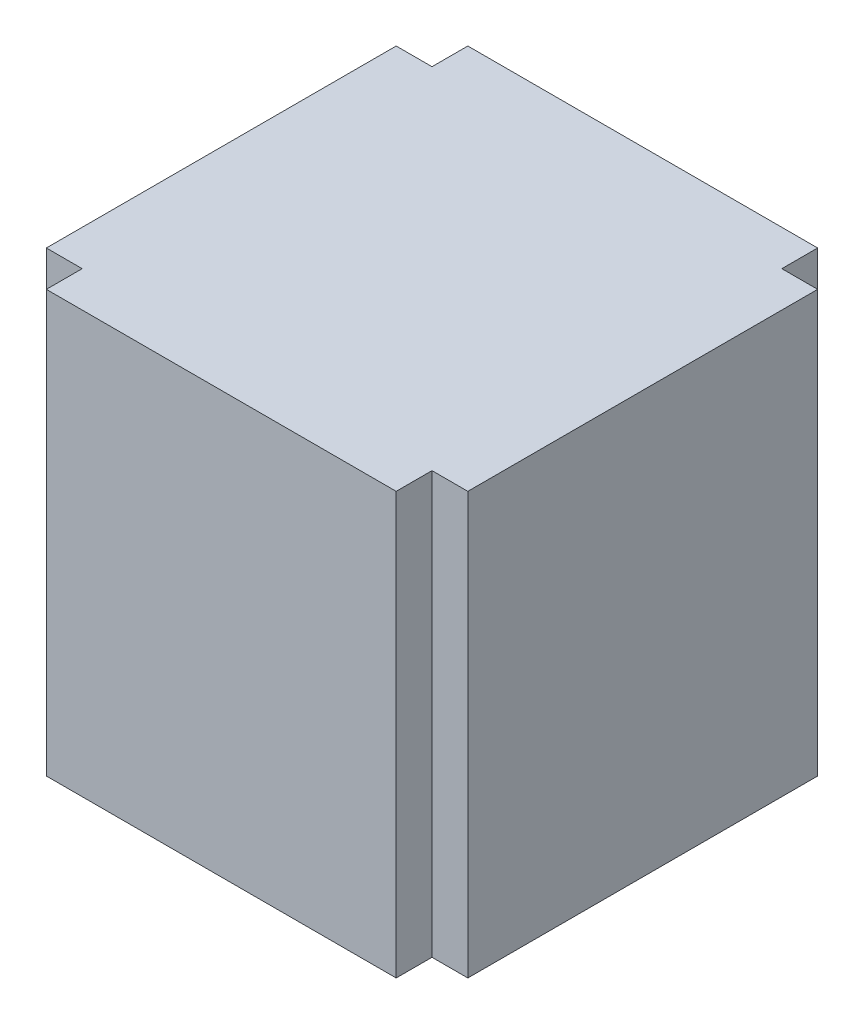
ISO-10303-21;
HEADER;
FILE_DESCRIPTION(('STEP AP214'),'2;1');
FILE_NAME('part.step','',(''),(''),'','','');
FILE_SCHEMA(('AUTOMOTIVE_DESIGN { 1 0 10303 214 1 1 1 1 }'));
ENDSEC;
DATA;
#1=APPLICATION_CONTEXT('core data for automotive mechanical design processes');
#2=APPLICATION_PROTOCOL_DEFINITION('international standard','automotive_design',2000,#1);
#3=PRODUCT_CONTEXT('',#1,'mechanical');
#4=PRODUCT('Part','Part','',(#3));
#5=PRODUCT_RELATED_PRODUCT_CATEGORY('part','',(#4));
#6=PRODUCT_DEFINITION_FORMATION('','',#4);
#7=PRODUCT_DEFINITION_CONTEXT('part definition',#1,'design');
#8=PRODUCT_DEFINITION('design','',#6,#7);
#9=PRODUCT_DEFINITION_SHAPE('','',#8);
#10=(LENGTH_UNIT() NAMED_UNIT(*) SI_UNIT(.MILLI.,.METRE.));
#11=(NAMED_UNIT(*) PLANE_ANGLE_UNIT() SI_UNIT($,.RADIAN.));
#12=(NAMED_UNIT(*) SI_UNIT($,.STERADIAN.) SOLID_ANGLE_UNIT());
#13=UNCERTAINTY_MEASURE_WITH_UNIT(LENGTH_MEASURE(1.E-05),#10,'distance_accuracy_value','');
#14=(GEOMETRIC_REPRESENTATION_CONTEXT(3) GLOBAL_UNCERTAINTY_ASSIGNED_CONTEXT((#13)) GLOBAL_UNIT_ASSIGNED_CONTEXT((#10,
#11,#12)) REPRESENTATION_CONTEXT('',''));
#15=CARTESIAN_POINT('',(0.,0.,0.));
#16=DIRECTION('',(0.,0.,1.));
#17=DIRECTION('',(1.,0.,0.));
#18=AXIS2_PLACEMENT_3D('',#15,#16,#17);
#19=CARTESIAN_POINT('',(41.5,50.,-41.5));
#20=DIRECTION('',(-1.,0.,0.));
#21=DIRECTION('',(0.,0.,1.));
#22=AXIS2_PLACEMENT_3D('',#19,#20,#21);
#23=PLANE('',#22);
#24=DIRECTION('',(0.,0.,-1.));
#25=VECTOR('',#24,1.);
#26=CARTESIAN_POINT('',(41.5,-50.,-41.5));
#27=LINE('',#26,#25);
#28=CARTESIAN_POINT('',(41.5,-50.,-41.5));
#29=VERTEX_POINT('',#28);
#30=CARTESIAN_POINT('',(41.5,-50.,-50.));
#31=VERTEX_POINT('',#30);
#32=EDGE_CURVE('E153',#29,#31,#27,.T.);
#33=ORIENTED_EDGE('',*,*,#32,.T.);
#34=DIRECTION('',(0.,-1.,0.));
#35=VECTOR('',#34,1.);
#36=CARTESIAN_POINT('',(41.5,50.,-50.));
#37=LINE('',#36,#35);
#38=CARTESIAN_POINT('',(41.5,50.,-50.));
#39=VERTEX_POINT('',#38);
#40=EDGE_CURVE('E11',#39,#31,#37,.T.);
#41=ORIENTED_EDGE('',*,*,#40,.F.);
#42=DIRECTION('',(0.,0.,-1.));
#43=VECTOR('',#42,1.);
#44=CARTESIAN_POINT('',(41.5,50.,-41.5));
#45=LINE('',#44,#43);
#46=CARTESIAN_POINT('',(41.5,50.,-41.5));
#47=VERTEX_POINT('',#46);
#48=EDGE_CURVE('E175',#47,#39,#45,.T.);
#49=ORIENTED_EDGE('',*,*,#48,.F.);
#50=DIRECTION('',(0.,-1.,0.));
#51=VECTOR('',#50,1.);
#52=CARTESIAN_POINT('',(41.5,50.,-41.5));
#53=LINE('',#52,#51);
#54=EDGE_CURVE('E149',#47,#29,#53,.T.);
#55=ORIENTED_EDGE('',*,*,#54,.T.);
#56=EDGE_LOOP('',(#33,#41,#49,#55));
#57=FACE_BOUND('',#56,.T.);
#58=ADVANCED_FACE('F33',(#57),#23,.F.);
#59=CARTESIAN_POINT('',(-41.5,50.,-50.));
#60=DIRECTION('',(0.,0.,1.));
#61=DIRECTION('',(1.,0.,0.));
#62=AXIS2_PLACEMENT_3D('',#59,#60,#61);
#63=PLANE('',#62);
#64=DIRECTION('',(-1.,0.,0.));
#65=VECTOR('',#64,1.);
#66=CARTESIAN_POINT('',(-41.5,-50.,-50.));
#67=LINE('',#66,#65);
#68=CARTESIAN_POINT('',(-41.5,-50.,-50.));
#69=VERTEX_POINT('',#68);
#70=EDGE_CURVE('E156',#31,#69,#67,.T.);
#71=ORIENTED_EDGE('',*,*,#70,.T.);
#72=DIRECTION('',(0.,-1.,0.));
#73=VECTOR('',#72,1.);
#74=CARTESIAN_POINT('',(-41.5,50.,-50.));
#75=LINE('',#74,#73);
#76=CARTESIAN_POINT('',(-41.5,50.,-50.));
#77=VERTEX_POINT('',#76);
#78=EDGE_CURVE('E41',#77,#69,#75,.T.);
#79=ORIENTED_EDGE('',*,*,#78,.F.);
#80=DIRECTION('',(-1.,0.,0.));
#81=VECTOR('',#80,1.);
#82=CARTESIAN_POINT('',(-41.5,50.,-50.));
#83=LINE('',#82,#81);
#84=EDGE_CURVE('E104',#39,#77,#83,.T.);
#85=ORIENTED_EDGE('',*,*,#84,.F.);
#86=ORIENTED_EDGE('',*,*,#40,.T.);
#87=EDGE_LOOP('',(#71,#79,#85,#86));
#88=FACE_BOUND('',#87,.T.);
#89=ADVANCED_FACE('F253',(#88),#63,.F.);
#90=CARTESIAN_POINT('',(-41.5,50.,-41.5));
#91=DIRECTION('',(1.,0.,0.));
#92=DIRECTION('',(0.,0.,-1.));
#93=AXIS2_PLACEMENT_3D('',#90,#91,#92);
#94=PLANE('',#93);
#95=DIRECTION('',(0.,0.,1.));
#96=VECTOR('',#95,1.);
#97=CARTESIAN_POINT('',(-41.5,-50.,-41.5));
#98=LINE('',#97,#96);
#99=CARTESIAN_POINT('',(-41.5,-50.,-41.5));
#100=VERTEX_POINT('',#99);
#101=EDGE_CURVE('E158',#69,#100,#98,.T.);
#102=ORIENTED_EDGE('',*,*,#101,.T.);
#103=DIRECTION('',(0.,-1.,0.));
#104=VECTOR('',#103,1.);
#105=CARTESIAN_POINT('',(-41.5,50.,-41.5));
#106=LINE('',#105,#104);
#107=CARTESIAN_POINT('',(-41.5,50.,-41.5));
#108=VERTEX_POINT('',#107);
#109=EDGE_CURVE('E194',#108,#100,#106,.T.);
#110=ORIENTED_EDGE('',*,*,#109,.F.);
#111=DIRECTION('',(0.,0.,1.));
#112=VECTOR('',#111,1.);
#113=CARTESIAN_POINT('',(-41.5,50.,-41.5));
#114=LINE('',#113,#112);
#115=EDGE_CURVE('E202',#77,#108,#114,.T.);
#116=ORIENTED_EDGE('',*,*,#115,.F.);
#117=ORIENTED_EDGE('',*,*,#78,.T.);
#118=EDGE_LOOP('',(#102,#110,#116,#117));
#119=FACE_BOUND('',#118,.T.);
#120=ADVANCED_FACE('F200',(#119),#94,.F.);
#121=CARTESIAN_POINT('',(-41.5,50.,-41.5));
#122=DIRECTION('',(0.,0.,1.));
#123=DIRECTION('',(1.,0.,0.));
#124=AXIS2_PLACEMENT_3D('',#121,#122,#123);
#125=PLANE('',#124);
#126=DIRECTION('',(-1.,0.,0.));
#127=VECTOR('',#126,1.);
#128=CARTESIAN_POINT('',(-41.5,-50.,-41.5));
#129=LINE('',#128,#127);
#130=CARTESIAN_POINT('',(-50.,-50.,-41.5));
#131=VERTEX_POINT('',#130);
#132=EDGE_CURVE('E160',#100,#131,#129,.T.);
#133=ORIENTED_EDGE('',*,*,#132,.T.);
#134=DIRECTION('',(0.,-1.,0.));
#135=VECTOR('',#134,1.);
#136=CARTESIAN_POINT('',(-50.,50.,-41.5));
#137=LINE('',#136,#135);
#138=CARTESIAN_POINT('',(-50.,50.,-41.5));
#139=VERTEX_POINT('',#138);
#140=EDGE_CURVE('E191',#139,#131,#137,.T.);
#141=ORIENTED_EDGE('',*,*,#140,.F.);
#142=DIRECTION('',(-1.,0.,0.));
#143=VECTOR('',#142,1.);
#144=CARTESIAN_POINT('',(-41.5,50.,-41.5));
#145=LINE('',#144,#143);
#146=EDGE_CURVE('E220',#108,#139,#145,.T.);
#147=ORIENTED_EDGE('',*,*,#146,.F.);
#148=ORIENTED_EDGE('',*,*,#109,.T.);
#149=EDGE_LOOP('',(#133,#141,#147,#148));
#150=FACE_BOUND('',#149,.T.);
#151=ADVANCED_FACE('F211',(#150),#125,.F.);
#152=CARTESIAN_POINT('',(-50.,50.,-41.5));
#153=DIRECTION('',(1.,0.,0.));
#154=DIRECTION('',(0.,0.,-1.));
#155=AXIS2_PLACEMENT_3D('',#152,#153,#154);
#156=PLANE('',#155);
#157=DIRECTION('',(0.,0.,1.));
#158=VECTOR('',#157,1.);
#159=CARTESIAN_POINT('',(-50.,-50.,-41.5));
#160=LINE('',#159,#158);
#161=CARTESIAN_POINT('',(-50.,-50.,41.5));
#162=VERTEX_POINT('',#161);
#163=EDGE_CURVE('E162',#131,#162,#160,.T.);
#164=ORIENTED_EDGE('',*,*,#163,.T.);
#165=DIRECTION('',(0.,-1.,0.));
#166=VECTOR('',#165,1.);
#167=CARTESIAN_POINT('',(-50.,50.,41.5));
#168=LINE('',#167,#166);
#169=CARTESIAN_POINT('',(-50.,50.,41.5));
#170=VERTEX_POINT('',#169);
#171=EDGE_CURVE('E188',#170,#162,#168,.T.);
#172=ORIENTED_EDGE('',*,*,#171,.F.);
#173=DIRECTION('',(0.,0.,1.));
#174=VECTOR('',#173,1.);
#175=CARTESIAN_POINT('',(-50.,50.,-41.5));
#176=LINE('',#175,#174);
#177=EDGE_CURVE('E217',#139,#170,#176,.T.);
#178=ORIENTED_EDGE('',*,*,#177,.F.);
#179=ORIENTED_EDGE('',*,*,#140,.T.);
#180=EDGE_LOOP('',(#164,#172,#178,#179));
#181=FACE_BOUND('',#180,.T.);
#182=ADVANCED_FACE('F215',(#181),#156,.F.);
#183=CARTESIAN_POINT('',(-41.5,50.,41.5));
#184=DIRECTION('',(0.,0.,-1.));
#185=DIRECTION('',(-1.,0.,0.));
#186=AXIS2_PLACEMENT_3D('',#183,#184,#185);
#187=PLANE('',#186);
#188=DIRECTION('',(1.,0.,0.));
#189=VECTOR('',#188,1.);
#190=CARTESIAN_POINT('',(-41.5,-50.,41.5));
#191=LINE('',#190,#189);
#192=CARTESIAN_POINT('',(-41.5,-50.,41.5));
#193=VERTEX_POINT('',#192);
#194=EDGE_CURVE('E164',#162,#193,#191,.T.);
#195=ORIENTED_EDGE('',*,*,#194,.T.);
#196=DIRECTION('',(0.,-1.,0.));
#197=VECTOR('',#196,1.);
#198=CARTESIAN_POINT('',(-41.5,50.,41.5));
#199=LINE('',#198,#197);
#200=CARTESIAN_POINT('',(-41.5,50.,41.5));
#201=VERTEX_POINT('',#200);
#202=EDGE_CURVE('E185',#201,#193,#199,.T.);
#203=ORIENTED_EDGE('',*,*,#202,.F.);
#204=DIRECTION('',(1.,0.,0.));
#205=VECTOR('',#204,1.);
#206=CARTESIAN_POINT('',(-41.5,50.,41.5));
#207=LINE('',#206,#205);
#208=EDGE_CURVE('E219',#170,#201,#207,.T.);
#209=ORIENTED_EDGE('',*,*,#208,.F.);
#210=ORIENTED_EDGE('',*,*,#171,.T.);
#211=EDGE_LOOP('',(#195,#203,#209,#210));
#212=FACE_BOUND('',#211,.T.);
#213=ADVANCED_FACE('F266',(#212),#187,.F.);
#214=CARTESIAN_POINT('',(-41.5,50.,41.5));
#215=DIRECTION('',(1.,0.,0.));
#216=DIRECTION('',(0.,0.,-1.));
#217=AXIS2_PLACEMENT_3D('',#214,#215,#216);
#218=PLANE('',#217);
#219=DIRECTION('',(0.,0.,1.));
#220=VECTOR('',#219,1.);
#221=CARTESIAN_POINT('',(-41.5,-50.,41.5));
#222=LINE('',#221,#220);
#223=CARTESIAN_POINT('',(-41.5,-50.,50.));
#224=VERTEX_POINT('',#223);
#225=EDGE_CURVE('E166',#193,#224,#222,.T.);
#226=ORIENTED_EDGE('',*,*,#225,.T.);
#227=DIRECTION('',(0.,-1.,0.));
#228=VECTOR('',#227,1.);
#229=CARTESIAN_POINT('',(-41.5,50.,50.));
#230=LINE('',#229,#228);
#231=CARTESIAN_POINT('',(-41.5,50.,50.));
#232=VERTEX_POINT('',#231);
#233=EDGE_CURVE('E182',#232,#224,#230,.T.);
#234=ORIENTED_EDGE('',*,*,#233,.F.);
#235=DIRECTION('',(0.,0.,1.));
#236=VECTOR('',#235,1.);
#237=CARTESIAN_POINT('',(-41.5,50.,41.5));
#238=LINE('',#237,#236);
#239=EDGE_CURVE('E222',#201,#232,#238,.T.);
#240=ORIENTED_EDGE('',*,*,#239,.F.);
#241=ORIENTED_EDGE('',*,*,#202,.T.);
#242=EDGE_LOOP('',(#226,#234,#240,#241));
#243=FACE_BOUND('',#242,.T.);
#244=ADVANCED_FACE('F269',(#243),#218,.F.);
#245=CARTESIAN_POINT('',(-41.5,50.,50.));
#246=DIRECTION('',(0.,0.,-1.));
#247=DIRECTION('',(-1.,0.,0.));
#248=AXIS2_PLACEMENT_3D('',#245,#246,#247);
#249=PLANE('',#248);
#250=DIRECTION('',(1.,0.,0.));
#251=VECTOR('',#250,1.);
#252=CARTESIAN_POINT('',(-41.5,-50.,50.));
#253=LINE('',#252,#251);
#254=CARTESIAN_POINT('',(41.5,-50.,50.));
#255=VERTEX_POINT('',#254);
#256=EDGE_CURVE('E168',#224,#255,#253,.T.);
#257=ORIENTED_EDGE('',*,*,#256,.T.);
#258=DIRECTION('',(0.,-1.,0.));
#259=VECTOR('',#258,1.);
#260=CARTESIAN_POINT('',(41.5,50.,50.));
#261=LINE('',#260,#259);
#262=CARTESIAN_POINT('',(41.5,50.,50.));
#263=VERTEX_POINT('',#262);
#264=EDGE_CURVE('E179',#263,#255,#261,.T.);
#265=ORIENTED_EDGE('',*,*,#264,.F.);
#266=DIRECTION('',(1.,0.,0.));
#267=VECTOR('',#266,1.);
#268=CARTESIAN_POINT('',(-41.5,50.,50.));
#269=LINE('',#268,#267);
#270=EDGE_CURVE('E228',#232,#263,#269,.T.);
#271=ORIENTED_EDGE('',*,*,#270,.F.);
#272=ORIENTED_EDGE('',*,*,#233,.T.);
#273=EDGE_LOOP('',(#257,#265,#271,#272));
#274=FACE_BOUND('',#273,.T.);
#275=ADVANCED_FACE('F234',(#274),#249,.F.);
#276=CARTESIAN_POINT('',(41.5,50.,41.5));
#277=DIRECTION('',(-1.,0.,0.));
#278=DIRECTION('',(0.,0.,1.));
#279=AXIS2_PLACEMENT_3D('',#276,#277,#278);
#280=PLANE('',#279);
#281=DIRECTION('',(0.,0.,-1.));
#282=VECTOR('',#281,1.);
#283=CARTESIAN_POINT('',(41.5,-50.,41.5));
#284=LINE('',#283,#282);
#285=CARTESIAN_POINT('',(41.5,-50.,41.5));
#286=VERTEX_POINT('',#285);
#287=EDGE_CURVE('E170',#255,#286,#284,.T.);
#288=ORIENTED_EDGE('',*,*,#287,.T.);
#289=DIRECTION('',(0.,-1.,0.));
#290=VECTOR('',#289,1.);
#291=CARTESIAN_POINT('',(41.5,50.,41.5));
#292=LINE('',#291,#290);
#293=CARTESIAN_POINT('',(41.5,50.,41.5));
#294=VERTEX_POINT('',#293);
#295=EDGE_CURVE('E144',#294,#286,#292,.T.);
#296=ORIENTED_EDGE('',*,*,#295,.F.);
#297=DIRECTION('',(0.,0.,-1.));
#298=VECTOR('',#297,1.);
#299=CARTESIAN_POINT('',(41.5,50.,41.5));
#300=LINE('',#299,#298);
#301=EDGE_CURVE('E135',#263,#294,#300,.T.);
#302=ORIENTED_EDGE('',*,*,#301,.F.);
#303=ORIENTED_EDGE('',*,*,#264,.T.);
#304=EDGE_LOOP('',(#288,#296,#302,#303));
#305=FACE_BOUND('',#304,.T.);
#306=ADVANCED_FACE('F238',(#305),#280,.F.);
#307=CARTESIAN_POINT('',(41.5,50.,41.5));
#308=DIRECTION('',(0.,0.,-1.));
#309=DIRECTION('',(-1.,0.,0.));
#310=AXIS2_PLACEMENT_3D('',#307,#308,#309);
#311=PLANE('',#310);
#312=DIRECTION('',(1.,0.,0.));
#313=VECTOR('',#312,1.);
#314=CARTESIAN_POINT('',(41.5,-50.,41.5));
#315=LINE('',#314,#313);
#316=CARTESIAN_POINT('',(50.,-50.,41.5));
#317=VERTEX_POINT('',#316);
#318=EDGE_CURVE('E143',#286,#317,#315,.T.);
#319=ORIENTED_EDGE('',*,*,#318,.T.);
#320=DIRECTION('',(0.,-1.,0.));
#321=VECTOR('',#320,1.);
#322=CARTESIAN_POINT('',(50.,50.,41.5));
#323=LINE('',#322,#321);
#324=CARTESIAN_POINT('',(50.,50.,41.5));
#325=VERTEX_POINT('',#324);
#326=EDGE_CURVE('E140',#325,#317,#323,.T.);
#327=ORIENTED_EDGE('',*,*,#326,.F.);
#328=DIRECTION('',(1.,0.,0.));
#329=VECTOR('',#328,1.);
#330=CARTESIAN_POINT('',(41.5,50.,41.5));
#331=LINE('',#330,#329);
#332=EDGE_CURVE('E129',#294,#325,#331,.T.);
#333=ORIENTED_EDGE('',*,*,#332,.F.);
#334=ORIENTED_EDGE('',*,*,#295,.T.);
#335=EDGE_LOOP('',(#319,#327,#333,#334));
#336=FACE_BOUND('',#335,.T.);
#337=ADVANCED_FACE('F141',(#336),#311,.F.);
#338=CARTESIAN_POINT('',(50.,50.,-41.5));
#339=DIRECTION('',(-1.,0.,0.));
#340=DIRECTION('',(0.,0.,1.));
#341=AXIS2_PLACEMENT_3D('',#338,#339,#340);
#342=PLANE('',#341);
#343=DIRECTION('',(0.,0.,-1.));
#344=VECTOR('',#343,1.);
#345=CARTESIAN_POINT('',(50.,-50.,-41.5));
#346=LINE('',#345,#344);
#347=CARTESIAN_POINT('',(50.,-50.,-41.5));
#348=VERTEX_POINT('',#347);
#349=EDGE_CURVE('E90',#317,#348,#346,.T.);
#350=ORIENTED_EDGE('',*,*,#349,.T.);
#351=DIRECTION('',(0.,-1.,0.));
#352=VECTOR('',#351,1.);
#353=CARTESIAN_POINT('',(50.,50.,-41.5));
#354=LINE('',#353,#352);
#355=CARTESIAN_POINT('',(50.,50.,-41.5));
#356=VERTEX_POINT('',#355);
#357=EDGE_CURVE('E145',#356,#348,#354,.T.);
#358=ORIENTED_EDGE('',*,*,#357,.F.);
#359=DIRECTION('',(0.,0.,-1.));
#360=VECTOR('',#359,1.);
#361=CARTESIAN_POINT('',(50.,50.,-41.5));
#362=LINE('',#361,#360);
#363=EDGE_CURVE('E133',#325,#356,#362,.T.);
#364=ORIENTED_EDGE('',*,*,#363,.F.);
#365=ORIENTED_EDGE('',*,*,#326,.T.);
#366=EDGE_LOOP('',(#350,#358,#364,#365));
#367=FACE_BOUND('',#366,.T.);
#368=ADVANCED_FACE('F147',(#367),#342,.F.);
#369=CARTESIAN_POINT('',(41.5,50.,-41.5));
#370=DIRECTION('',(0.,0.,1.));
#371=DIRECTION('',(1.,0.,0.));
#372=AXIS2_PLACEMENT_3D('',#369,#370,#371);
#373=PLANE('',#372);
#374=DIRECTION('',(-1.,0.,0.));
#375=VECTOR('',#374,1.);
#376=CARTESIAN_POINT('',(41.5,-50.,-41.5));
#377=LINE('',#376,#375);
#378=EDGE_CURVE('E96',#348,#29,#377,.T.);
#379=ORIENTED_EDGE('',*,*,#378,.T.);
#380=ORIENTED_EDGE('',*,*,#54,.F.);
#381=DIRECTION('',(-1.,0.,0.));
#382=VECTOR('',#381,1.);
#383=CARTESIAN_POINT('',(41.5,50.,-41.5));
#384=LINE('',#383,#382);
#385=EDGE_CURVE('E49',#356,#47,#384,.T.);
#386=ORIENTED_EDGE('',*,*,#385,.F.);
#387=ORIENTED_EDGE('',*,*,#357,.T.);
#388=EDGE_LOOP('',(#379,#380,#386,#387));
#389=FACE_BOUND('',#388,.T.);
#390=ADVANCED_FACE('F242',(#389),#373,.F.);
#391=CARTESIAN_POINT('',(0.,50.,0.));
#392=DIRECTION('',(0.,-1.,0.));
#393=DIRECTION('',(0.,0.,-1.));
#394=AXIS2_PLACEMENT_3D('',#391,#392,#393);
#395=PLANE('',#394);
#396=ORIENTED_EDGE('',*,*,#48,.T.);
#397=ORIENTED_EDGE('',*,*,#84,.T.);
#398=ORIENTED_EDGE('',*,*,#115,.T.);
#399=ORIENTED_EDGE('',*,*,#146,.T.);
#400=ORIENTED_EDGE('',*,*,#177,.T.);
#401=ORIENTED_EDGE('',*,*,#208,.T.);
#402=ORIENTED_EDGE('',*,*,#239,.T.);
#403=ORIENTED_EDGE('',*,*,#270,.T.);
#404=ORIENTED_EDGE('',*,*,#301,.T.);
#405=ORIENTED_EDGE('',*,*,#332,.T.);
#406=ORIENTED_EDGE('',*,*,#363,.T.);
#407=ORIENTED_EDGE('',*,*,#385,.T.);
#408=EDGE_LOOP('',(#396,#397,#398,#399,#400,#401,#402,#403,#404,#405,#406,#407));
#409=FACE_BOUND('',#408,.T.);
#410=ADVANCED_FACE('F131',(#409),#395,.F.);
#411=CARTESIAN_POINT('',(0.,-50.,0.));
#412=DIRECTION('',(0.,-1.,0.));
#413=DIRECTION('',(0.,0.,-1.));
#414=AXIS2_PLACEMENT_3D('',#411,#412,#413);
#415=PLANE('',#414);
#416=ORIENTED_EDGE('',*,*,#32,.F.);
#417=ORIENTED_EDGE('',*,*,#378,.F.);
#418=ORIENTED_EDGE('',*,*,#349,.F.);
#419=ORIENTED_EDGE('',*,*,#318,.F.);
#420=ORIENTED_EDGE('',*,*,#287,.F.);
#421=ORIENTED_EDGE('',*,*,#256,.F.);
#422=ORIENTED_EDGE('',*,*,#225,.F.);
#423=ORIENTED_EDGE('',*,*,#194,.F.);
#424=ORIENTED_EDGE('',*,*,#163,.F.);
#425=ORIENTED_EDGE('',*,*,#132,.F.);
#426=ORIENTED_EDGE('',*,*,#101,.F.);
#427=ORIENTED_EDGE('',*,*,#70,.F.);
#428=EDGE_LOOP('',(#416,#417,#418,#419,#420,#421,#422,#423,#424,#425,#426,#427));
#429=FACE_BOUND('',#428,.T.);
#430=ADVANCED_FACE('F206',(#429),#415,.T.);
#431=CLOSED_SHELL('',(#58,#89,#120,#151,#182,#213,#244,#275,#306,#337,#368,#390,#410,#430));
#432=MANIFOLD_SOLID_BREP('B2',#431);
#433=ADVANCED_BREP_SHAPE_REPRESENTATION('',(#18,#432),#14);
#434=SHAPE_DEFINITION_REPRESENTATION(#9,#433);
ENDSEC;
END-ISO-10303-21;
